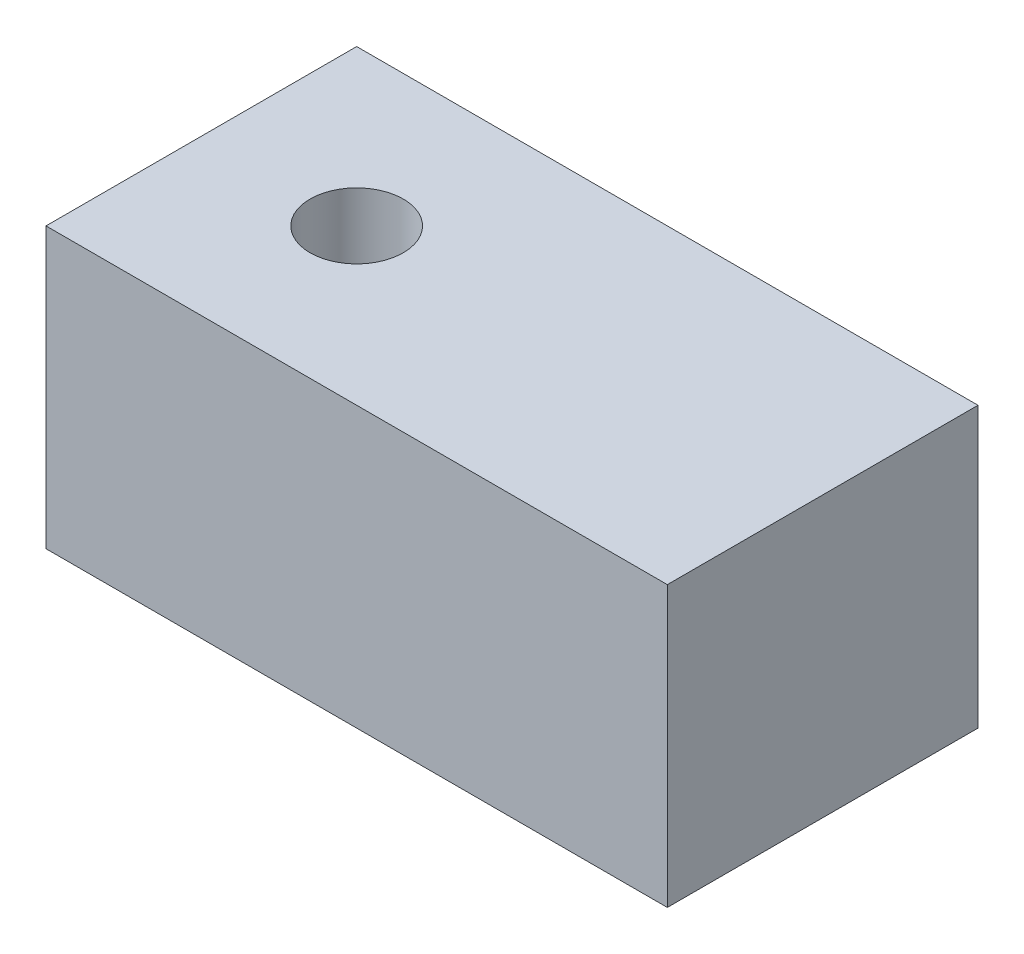
ISO-10303-21;
HEADER;
FILE_DESCRIPTION(('STEP AP214'),'2;1');
FILE_NAME('part.step','',(''),(''),'','','');
FILE_SCHEMA(('AUTOMOTIVE_DESIGN { 1 0 10303 214 1 1 1 1 }'));
ENDSEC;
DATA;
#1=APPLICATION_CONTEXT('core data for automotive mechanical design processes');
#2=APPLICATION_PROTOCOL_DEFINITION('international standard','automotive_design',2000,#1);
#3=PRODUCT_CONTEXT('',#1,'mechanical');
#4=PRODUCT('Part','Part','',(#3));
#5=PRODUCT_RELATED_PRODUCT_CATEGORY('part','',(#4));
#6=PRODUCT_DEFINITION_FORMATION('','',#4);
#7=PRODUCT_DEFINITION_CONTEXT('part definition',#1,'design');
#8=PRODUCT_DEFINITION('design','',#6,#7);
#9=PRODUCT_DEFINITION_SHAPE('','',#8);
#10=(LENGTH_UNIT() NAMED_UNIT(*) SI_UNIT(.MILLI.,.METRE.));
#11=(NAMED_UNIT(*) PLANE_ANGLE_UNIT() SI_UNIT($,.RADIAN.));
#12=(NAMED_UNIT(*) SI_UNIT($,.STERADIAN.) SOLID_ANGLE_UNIT());
#13=UNCERTAINTY_MEASURE_WITH_UNIT(LENGTH_MEASURE(1.E-05),#10,'distance_accuracy_value','');
#14=(GEOMETRIC_REPRESENTATION_CONTEXT(3) GLOBAL_UNCERTAINTY_ASSIGNED_CONTEXT((#13)) GLOBAL_UNIT_ASSIGNED_CONTEXT((#10,
#11,#12)) REPRESENTATION_CONTEXT('',''));
#15=CARTESIAN_POINT('',(0.,0.,0.));
#16=DIRECTION('',(0.,0.,1.));
#17=DIRECTION('',(1.,0.,0.));
#18=AXIS2_PLACEMENT_3D('',#15,#16,#17);
#19=CARTESIAN_POINT('',(10.,9.,-5.));
#20=DIRECTION('',(-1.,0.,0.));
#21=DIRECTION('',(0.,0.,1.));
#22=AXIS2_PLACEMENT_3D('',#19,#20,#21);
#23=PLANE('',#22);
#24=DIRECTION('',(0.,0.,-1.));
#25=VECTOR('',#24,1.);
#26=CARTESIAN_POINT('',(10.,0.,-5.));
#27=LINE('',#26,#25);
#28=CARTESIAN_POINT('',(10.,0.,5.));
#29=VERTEX_POINT('',#28);
#30=CARTESIAN_POINT('',(10.,0.,-5.));
#31=VERTEX_POINT('',#30);
#32=EDGE_CURVE('E104',#29,#31,#27,.T.);
#33=ORIENTED_EDGE('',*,*,#32,.T.);
#34=DIRECTION('',(0.,-1.,0.));
#35=VECTOR('',#34,1.);
#36=CARTESIAN_POINT('',(10.,9.,-5.));
#37=LINE('',#36,#35);
#38=CARTESIAN_POINT('',(10.,9.,-5.));
#39=VERTEX_POINT('',#38);
#40=EDGE_CURVE('E11',#39,#31,#37,.T.);
#41=ORIENTED_EDGE('',*,*,#40,.F.);
#42=DIRECTION('',(0.,0.,-1.));
#43=VECTOR('',#42,1.);
#44=CARTESIAN_POINT('',(10.,9.,-5.));
#45=LINE('',#44,#43);
#46=CARTESIAN_POINT('',(10.,9.,5.));
#47=VERTEX_POINT('',#46);
#48=EDGE_CURVE('E92',#47,#39,#45,.T.);
#49=ORIENTED_EDGE('',*,*,#48,.F.);
#50=DIRECTION('',(0.,-1.,0.));
#51=VECTOR('',#50,1.);
#52=CARTESIAN_POINT('',(10.,9.,5.));
#53=LINE('',#52,#51);
#54=EDGE_CURVE('E100',#47,#29,#53,.T.);
#55=ORIENTED_EDGE('',*,*,#54,.T.);
#56=EDGE_LOOP('',(#33,#41,#49,#55));
#57=FACE_BOUND('',#56,.T.);
#58=ADVANCED_FACE('F41',(#57),#23,.F.);
#59=CARTESIAN_POINT('',(-10.,9.,-5.));
#60=DIRECTION('',(0.,0.,1.));
#61=DIRECTION('',(1.,0.,0.));
#62=AXIS2_PLACEMENT_3D('',#59,#60,#61);
#63=PLANE('',#62);
#64=DIRECTION('',(-1.,0.,0.));
#65=VECTOR('',#64,1.);
#66=CARTESIAN_POINT('',(-10.,0.,-5.));
#67=LINE('',#66,#65);
#68=CARTESIAN_POINT('',(-10.,0.,-5.));
#69=VERTEX_POINT('',#68);
#70=EDGE_CURVE('E96',#31,#69,#67,.T.);
#71=ORIENTED_EDGE('',*,*,#70,.T.);
#72=DIRECTION('',(0.,-1.,0.));
#73=VECTOR('',#72,1.);
#74=CARTESIAN_POINT('',(-10.,9.,-5.));
#75=LINE('',#74,#73);
#76=CARTESIAN_POINT('',(-10.,9.,-5.));
#77=VERTEX_POINT('',#76);
#78=EDGE_CURVE('E49',#77,#69,#75,.T.);
#79=ORIENTED_EDGE('',*,*,#78,.F.);
#80=DIRECTION('',(-1.,0.,0.));
#81=VECTOR('',#80,1.);
#82=CARTESIAN_POINT('',(-10.,9.,-5.));
#83=LINE('',#82,#81);
#84=EDGE_CURVE('E87',#39,#77,#83,.T.);
#85=ORIENTED_EDGE('',*,*,#84,.F.);
#86=ORIENTED_EDGE('',*,*,#40,.T.);
#87=EDGE_LOOP('',(#71,#79,#85,#86));
#88=FACE_BOUND('',#87,.T.);
#89=ADVANCED_FACE('F95',(#88),#63,.F.);
#90=CARTESIAN_POINT('',(-10.,9.,-5.));
#91=DIRECTION('',(1.,0.,0.));
#92=DIRECTION('',(0.,0.,-1.));
#93=AXIS2_PLACEMENT_3D('',#90,#91,#92);
#94=PLANE('',#93);
#95=DIRECTION('',(0.,0.,1.));
#96=VECTOR('',#95,1.);
#97=CARTESIAN_POINT('',(-10.,0.,-5.));
#98=LINE('',#97,#96);
#99=CARTESIAN_POINT('',(-9.99999999999999,0.,5.));
#100=VERTEX_POINT('',#99);
#101=EDGE_CURVE('E74',#69,#100,#98,.T.);
#102=ORIENTED_EDGE('',*,*,#101,.T.);
#103=DIRECTION('',(0.,-1.,0.));
#104=VECTOR('',#103,1.);
#105=CARTESIAN_POINT('',(-9.99999999999999,9.,5.));
#106=LINE('',#105,#104);
#107=CARTESIAN_POINT('',(-9.99999999999999,9.,5.));
#108=VERTEX_POINT('',#107);
#109=EDGE_CURVE('E97',#108,#100,#106,.T.);
#110=ORIENTED_EDGE('',*,*,#109,.F.);
#111=DIRECTION('',(0.,0.,1.));
#112=VECTOR('',#111,1.);
#113=CARTESIAN_POINT('',(-10.,9.,-5.));
#114=LINE('',#113,#112);
#115=EDGE_CURVE('E90',#77,#108,#114,.T.);
#116=ORIENTED_EDGE('',*,*,#115,.F.);
#117=ORIENTED_EDGE('',*,*,#78,.T.);
#118=EDGE_LOOP('',(#102,#110,#116,#117));
#119=FACE_BOUND('',#118,.T.);
#120=ADVANCED_FACE('F98',(#119),#94,.F.);
#121=CARTESIAN_POINT('',(-9.99999999999999,9.,5.));
#122=DIRECTION('',(0.,0.,-1.));
#123=DIRECTION('',(-1.,0.,0.));
#124=AXIS2_PLACEMENT_3D('',#121,#122,#123);
#125=PLANE('',#124);
#126=DIRECTION('',(1.,0.,0.));
#127=VECTOR('',#126,1.);
#128=CARTESIAN_POINT('',(-9.99999999999999,0.,5.));
#129=LINE('',#128,#127);
#130=EDGE_CURVE('E80',#100,#29,#129,.T.);
#131=ORIENTED_EDGE('',*,*,#130,.T.);
#132=ORIENTED_EDGE('',*,*,#54,.F.);
#133=DIRECTION('',(1.,0.,0.));
#134=VECTOR('',#133,1.);
#135=CARTESIAN_POINT('',(-9.99999999999999,9.,5.));
#136=LINE('',#135,#134);
#137=EDGE_CURVE('E57',#108,#47,#136,.T.);
#138=ORIENTED_EDGE('',*,*,#137,.F.);
#139=ORIENTED_EDGE('',*,*,#109,.T.);
#140=EDGE_LOOP('',(#131,#132,#138,#139));
#141=FACE_BOUND('',#140,.T.);
#142=ADVANCED_FACE('F112',(#141),#125,.F.);
#143=CARTESIAN_POINT('',(0.,9.,0.));
#144=DIRECTION('',(0.,1.,0.));
#145=DIRECTION('',(0.,0.,1.));
#146=AXIS2_PLACEMENT_3D('',#143,#144,#145);
#147=PLANE('',#146);
#148=CARTESIAN_POINT('',(-4.99999999999999,9.,0.));
#149=DIRECTION('',(0.,1.,0.));
#150=DIRECTION('',(0.,0.,1.));
#151=AXIS2_PLACEMENT_3D('',#148,#149,#150);
#152=CIRCLE('',#151,1.5);
#153=CARTESIAN_POINT('',(-4.99999999999999,9.,1.5));
#154=VERTEX_POINT('',#153);
#155=EDGE_CURVE('E118',#154,#154,#152,.T.);
#156=ORIENTED_EDGE('',*,*,#155,.F.);
#157=EDGE_LOOP('',(#156));
#158=FACE_BOUND('',#157,.T.);
#159=ORIENTED_EDGE('',*,*,#48,.T.);
#160=ORIENTED_EDGE('',*,*,#84,.T.);
#161=ORIENTED_EDGE('',*,*,#115,.T.);
#162=ORIENTED_EDGE('',*,*,#137,.T.);
#163=EDGE_LOOP('',(#159,#160,#161,#162));
#164=FACE_BOUND('',#163,.T.);
#165=ADVANCED_FACE('F88',(#158,#164),#147,.T.);
#166=CARTESIAN_POINT('',(0.,0.,0.));
#167=DIRECTION('',(0.,1.,0.));
#168=DIRECTION('',(0.,0.,1.));
#169=AXIS2_PLACEMENT_3D('',#166,#167,#168);
#170=PLANE('',#169);
#171=CARTESIAN_POINT('',(-4.99999999999999,0.,0.));
#172=DIRECTION('',(0.,1.,0.));
#173=DIRECTION('',(0.,0.,1.));
#174=AXIS2_PLACEMENT_3D('',#171,#172,#173);
#175=CIRCLE('',#174,1.5);
#176=CARTESIAN_POINT('',(-4.99999999999999,0.,1.5));
#177=VERTEX_POINT('',#176);
#178=EDGE_CURVE('E107',#177,#177,#175,.T.);
#179=ORIENTED_EDGE('',*,*,#178,.T.);
#180=EDGE_LOOP('',(#179));
#181=FACE_BOUND('',#180,.T.);
#182=ORIENTED_EDGE('',*,*,#32,.F.);
#183=ORIENTED_EDGE('',*,*,#130,.F.);
#184=ORIENTED_EDGE('',*,*,#101,.F.);
#185=ORIENTED_EDGE('',*,*,#70,.F.);
#186=EDGE_LOOP('',(#182,#183,#184,#185));
#187=FACE_BOUND('',#186,.T.);
#188=ADVANCED_FACE('F115',(#181,#187),#170,.F.);
#189=CARTESIAN_POINT('',(-4.99999999999999,0.,0.));
#190=DIRECTION('',(0.,1.,0.));
#191=DIRECTION('',(0.,0.,1.));
#192=AXIS2_PLACEMENT_3D('',#189,#190,#191);
#193=CYLINDRICAL_SURFACE('',#192,1.5);
#194=ORIENTED_EDGE('',*,*,#178,.F.);
#195=EDGE_LOOP('',(#194));
#196=FACE_BOUND('',#195,.T.);
#197=ORIENTED_EDGE('',*,*,#155,.T.);
#198=EDGE_LOOP('',(#197));
#199=FACE_BOUND('',#198,.T.);
#200=ADVANCED_FACE('F125',(#196,#199),#193,.F.);
#201=CLOSED_SHELL('',(#58,#89,#120,#142,#165,#188,#200));
#202=MANIFOLD_SOLID_BREP('B2',#201);
#203=ADVANCED_BREP_SHAPE_REPRESENTATION('',(#18,#202),#14);
#204=SHAPE_DEFINITION_REPRESENTATION(#9,#203);
ENDSEC;
END-ISO-10303-21;
